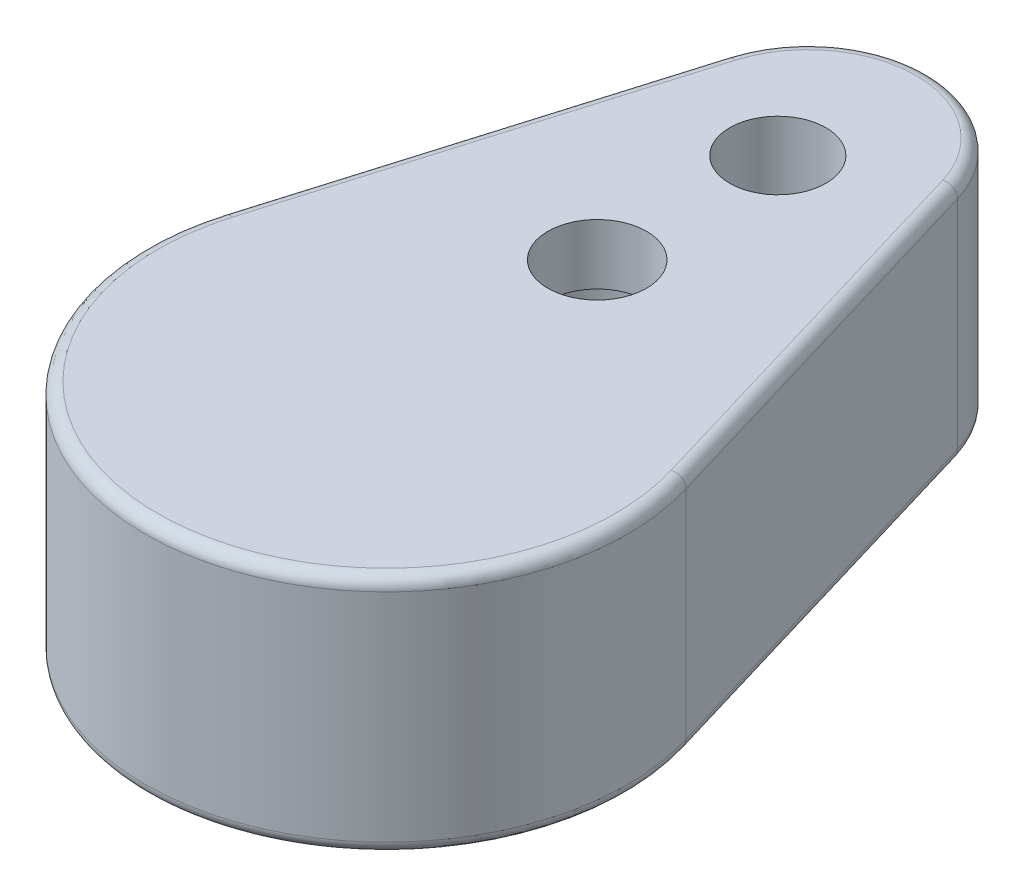
ISO-10303-21;
HEADER;
FILE_DESCRIPTION(('STEP AP214'),'2;1');
FILE_NAME('part.step','',(''),(''),'','','');
FILE_SCHEMA(('AUTOMOTIVE_DESIGN { 1 0 10303 214 1 1 1 1 }'));
ENDSEC;
DATA;
#1=APPLICATION_CONTEXT('core data for automotive mechanical design processes');
#2=APPLICATION_PROTOCOL_DEFINITION('international standard','automotive_design',2000,#1);
#3=PRODUCT_CONTEXT('',#1,'mechanical');
#4=PRODUCT('Part','Part','',(#3));
#5=PRODUCT_RELATED_PRODUCT_CATEGORY('part','',(#4));
#6=PRODUCT_DEFINITION_FORMATION('','',#4);
#7=PRODUCT_DEFINITION_CONTEXT('part definition',#1,'design');
#8=PRODUCT_DEFINITION('design','',#6,#7);
#9=PRODUCT_DEFINITION_SHAPE('','',#8);
#10=(LENGTH_UNIT() NAMED_UNIT(*) SI_UNIT(.MILLI.,.METRE.));
#11=(NAMED_UNIT(*) PLANE_ANGLE_UNIT() SI_UNIT($,.RADIAN.));
#12=(NAMED_UNIT(*) SI_UNIT($,.STERADIAN.) SOLID_ANGLE_UNIT());
#13=UNCERTAINTY_MEASURE_WITH_UNIT(LENGTH_MEASURE(1.E-05),#10,'distance_accuracy_value','');
#14=(GEOMETRIC_REPRESENTATION_CONTEXT(3) GLOBAL_UNCERTAINTY_ASSIGNED_CONTEXT((#13)) GLOBAL_UNIT_ASSIGNED_CONTEXT((#10,
#11,#12)) REPRESENTATION_CONTEXT('',''));
#15=CARTESIAN_POINT('',(0.,0.,0.));
#16=DIRECTION('',(0.,0.,1.));
#17=DIRECTION('',(1.,0.,0.));
#18=AXIS2_PLACEMENT_3D('',#15,#16,#17);
#19=CARTESIAN_POINT('',(0.,20.,17.5));
#20=DIRECTION('',(0.,-1.,0.));
#21=DIRECTION('',(0.,0.,-1.));
#22=AXIS2_PLACEMENT_3D('',#19,#20,#21);
#23=CYLINDRICAL_SURFACE('',#22,20.);
#24=DIRECTION('',(0.,-1.,0.));
#25=VECTOR('',#24,1.);
#26=CARTESIAN_POINT('',(-19.1662969499982,20.,11.7857142857143));
#27=LINE('',#26,#25);
#28=CARTESIAN_POINT('',(-19.1662969499982,19.,11.7857142857143));
#29=VERTEX_POINT('',#28);
#30=CARTESIAN_POINT('',(-19.1662969499982,1.,11.7857142857143));
#31=VERTEX_POINT('',#30);
#32=EDGE_CURVE('E111',#29,#31,#27,.T.);
#33=ORIENTED_EDGE('',*,*,#32,.T.);
#34=CARTESIAN_POINT('',(0.,1.,17.5));
#35=DIRECTION('',(0.,1.,0.));
#36=DIRECTION('',(0.,0.,1.));
#37=AXIS2_PLACEMENT_3D('',#34,#35,#36);
#38=CIRCLE('',#37,20.);
#39=CARTESIAN_POINT('',(19.1662969499982,1.,11.7857142857143));
#40=VERTEX_POINT('',#39);
#41=EDGE_CURVE('E224',#31,#40,#38,.T.);
#42=ORIENTED_EDGE('',*,*,#41,.T.);
#43=DIRECTION('',(0.,-1.,0.));
#44=VECTOR('',#43,1.);
#45=CARTESIAN_POINT('',(19.1662969499982,20.,11.7857142857143));
#46=LINE('',#45,#44);
#47=CARTESIAN_POINT('',(19.1662969499982,19.,11.7857142857143));
#48=VERTEX_POINT('',#47);
#49=EDGE_CURVE('E140',#48,#40,#46,.T.);
#50=ORIENTED_EDGE('',*,*,#49,.F.);
#51=CARTESIAN_POINT('',(0.,19.,17.5));
#52=DIRECTION('',(0.,1.,0.));
#53=DIRECTION('',(0.,0.,1.));
#54=AXIS2_PLACEMENT_3D('',#51,#52,#53);
#55=CIRCLE('',#54,20.);
#56=EDGE_CURVE('E221',#48,#29,#55,.F.);
#57=ORIENTED_EDGE('',*,*,#56,.T.);
#58=EDGE_LOOP('',(#33,#42,#50,#57));
#59=FACE_BOUND('',#58,.T.);
#60=ADVANCED_FACE('F39',(#59),#23,.T.);
#61=CARTESIAN_POINT('',(9.58314847499909,20.,-20.3571428571429));
#62=DIRECTION('',(-0.95831484749991,0.,0.285714285714286));
#63=DIRECTION('',(0.285714285714286,0.,0.95831484749991));
#64=AXIS2_PLACEMENT_3D('',#61,#62,#63);
#65=PLANE('',#64);
#66=ORIENTED_EDGE('',*,*,#49,.T.);
#67=DIRECTION('',(-0.285714285714286,0.,-0.95831484749991));
#68=VECTOR('',#67,1.);
#69=CARTESIAN_POINT('',(9.58314847499909,1.,-20.3571428571429));
#70=LINE('',#69,#68);
#71=CARTESIAN_POINT('',(9.5831484749991,1.,-20.3571428571429));
#72=VERTEX_POINT('',#71);
#73=EDGE_CURVE('E218',#40,#72,#70,.T.);
#74=ORIENTED_EDGE('',*,*,#73,.T.);
#75=DIRECTION('',(0.,-1.,0.));
#76=VECTOR('',#75,1.);
#77=CARTESIAN_POINT('',(9.5831484749991,20.,-20.3571428571429));
#78=LINE('',#77,#76);
#79=CARTESIAN_POINT('',(9.5831484749991,19.,-20.3571428571429));
#80=VERTEX_POINT('',#79);
#81=EDGE_CURVE('E130',#80,#72,#78,.T.);
#82=ORIENTED_EDGE('',*,*,#81,.F.);
#83=DIRECTION('',(-0.285714285714286,0.,-0.95831484749991));
#84=VECTOR('',#83,1.);
#85=CARTESIAN_POINT('',(19.1662969499982,19.,11.7857142857143));
#86=LINE('',#85,#84);
#87=EDGE_CURVE('E215',#80,#48,#86,.F.);
#88=ORIENTED_EDGE('',*,*,#87,.T.);
#89=EDGE_LOOP('',(#66,#74,#82,#88));
#90=FACE_BOUND('',#89,.T.);
#91=ADVANCED_FACE('F284',(#90),#65,.F.);
#92=CARTESIAN_POINT('',(0.,20.,-17.5));
#93=DIRECTION('',(0.,-1.,0.));
#94=DIRECTION('',(0.,0.,-1.));
#95=AXIS2_PLACEMENT_3D('',#92,#93,#94);
#96=CYLINDRICAL_SURFACE('',#95,10.);
#97=ORIENTED_EDGE('',*,*,#81,.T.);
#98=CARTESIAN_POINT('',(0.,1.,-17.5));
#99=DIRECTION('',(0.,1.,0.));
#100=DIRECTION('',(0.,0.,1.));
#101=AXIS2_PLACEMENT_3D('',#98,#99,#100);
#102=CIRCLE('',#101,10.);
#103=CARTESIAN_POINT('',(-9.5831484749991,1.,-20.3571428571429));
#104=VERTEX_POINT('',#103);
#105=EDGE_CURVE('E128',#72,#104,#102,.T.);
#106=ORIENTED_EDGE('',*,*,#105,.T.);
#107=DIRECTION('',(0.,-1.,0.));
#108=VECTOR('',#107,1.);
#109=CARTESIAN_POINT('',(-9.5831484749991,20.,-20.3571428571429));
#110=LINE('',#109,#108);
#111=CARTESIAN_POINT('',(-9.5831484749991,19.,-20.3571428571429));
#112=VERTEX_POINT('',#111);
#113=EDGE_CURVE('E109',#112,#104,#110,.T.);
#114=ORIENTED_EDGE('',*,*,#113,.F.);
#115=CARTESIAN_POINT('',(0.,19.,-17.5));
#116=DIRECTION('',(0.,1.,0.));
#117=DIRECTION('',(0.,0.,1.));
#118=AXIS2_PLACEMENT_3D('',#115,#116,#117);
#119=CIRCLE('',#118,10.);
#120=EDGE_CURVE('E125',#112,#80,#119,.F.);
#121=ORIENTED_EDGE('',*,*,#120,.T.);
#122=EDGE_LOOP('',(#97,#106,#114,#121));
#123=FACE_BOUND('',#122,.T.);
#124=ADVANCED_FACE('F124',(#123),#96,.T.);
#125=CARTESIAN_POINT('',(-9.5831484749991,20.,-20.3571428571429));
#126=DIRECTION('',(0.95831484749991,0.,0.285714285714286));
#127=DIRECTION('',(0.285714285714286,0.,-0.95831484749991));
#128=AXIS2_PLACEMENT_3D('',#125,#126,#127);
#129=PLANE('',#128);
#130=ORIENTED_EDGE('',*,*,#113,.T.);
#131=DIRECTION('',(-0.285714285714286,0.,0.95831484749991));
#132=VECTOR('',#131,1.);
#133=CARTESIAN_POINT('',(-9.5831484749991,1.,-20.3571428571429));
#134=LINE('',#133,#132);
#135=EDGE_CURVE('E11',#104,#31,#134,.T.);
#136=ORIENTED_EDGE('',*,*,#135,.T.);
#137=ORIENTED_EDGE('',*,*,#32,.F.);
#138=DIRECTION('',(-0.285714285714286,0.,0.95831484749991));
#139=VECTOR('',#138,1.);
#140=CARTESIAN_POINT('',(-9.5831484749991,19.,-20.3571428571429));
#141=LINE('',#140,#139);
#142=EDGE_CURVE('E49',#29,#112,#141,.F.);
#143=ORIENTED_EDGE('',*,*,#142,.T.);
#144=EDGE_LOOP('',(#130,#136,#137,#143));
#145=FACE_BOUND('',#144,.T.);
#146=ADVANCED_FACE('F108',(#145),#129,.F.);
#147=CARTESIAN_POINT('',(0.,20.,17.5));
#148=DIRECTION('',(0.,1.,0.));
#149=DIRECTION('',(0.,0.,1.));
#150=AXIS2_PLACEMENT_3D('',#147,#148,#149);
#151=PLANE('',#150);
#152=CARTESIAN_POINT('',(0.,20.,0.));
#153=DIRECTION('',(0.,-1.,0.));
#154=DIRECTION('',(0.,0.,-1.));
#155=AXIS2_PLACEMENT_3D('',#152,#153,#154);
#156=CIRCLE('',#155,4.1);
#157=CARTESIAN_POINT('',(0.,20.,-4.1));
#158=VERTEX_POINT('',#157);
#159=EDGE_CURVE('E167',#158,#158,#156,.T.);
#160=ORIENTED_EDGE('',*,*,#159,.T.);
#161=EDGE_LOOP('',(#160));
#162=FACE_BOUND('',#161,.T.);
#163=CARTESIAN_POINT('',(0.,20.,-15.));
#164=DIRECTION('',(0.,1.,0.));
#165=DIRECTION('',(0.,0.,1.));
#166=AXIS2_PLACEMENT_3D('',#163,#164,#165);
#167=CIRCLE('',#166,4.);
#168=CARTESIAN_POINT('',(0.,20.,-11.));
#169=VERTEX_POINT('',#168);
#170=EDGE_CURVE('E152',#169,#169,#167,.T.);
#171=ORIENTED_EDGE('',*,*,#170,.F.);
#172=EDGE_LOOP('',(#171));
#173=FACE_BOUND('',#172,.T.);
#174=DIRECTION('',(-0.285714285714286,0.,-0.95831484749991));
#175=VECTOR('',#174,1.);
#176=CARTESIAN_POINT('',(8.62483362749918,20.,-20.0714285714286));
#177=LINE('',#176,#175);
#178=CARTESIAN_POINT('',(18.2079821024983,20.,12.0714285714286));
#179=VERTEX_POINT('',#178);
#180=CARTESIAN_POINT('',(8.62483362749918,20.,-20.0714285714286));
#181=VERTEX_POINT('',#180);
#182=EDGE_CURVE('E57',#179,#181,#177,.T.);
#183=ORIENTED_EDGE('',*,*,#182,.T.);
#184=CARTESIAN_POINT('',(0.,20.,-17.5));
#185=DIRECTION('',(0.,1.,0.));
#186=DIRECTION('',(0.,0.,1.));
#187=AXIS2_PLACEMENT_3D('',#184,#185,#186);
#188=CIRCLE('',#187,9.);
#189=CARTESIAN_POINT('',(-8.62483362749919,20.,-20.0714285714286));
#190=VERTEX_POINT('',#189);
#191=EDGE_CURVE('E117',#181,#190,#188,.T.);
#192=ORIENTED_EDGE('',*,*,#191,.T.);
#193=DIRECTION('',(-0.285714285714286,0.,0.95831484749991));
#194=VECTOR('',#193,1.);
#195=CARTESIAN_POINT('',(-18.2079821024983,20.,12.0714285714286));
#196=LINE('',#195,#194);
#197=CARTESIAN_POINT('',(-18.2079821024983,20.,12.0714285714286));
#198=VERTEX_POINT('',#197);
#199=EDGE_CURVE('E143',#190,#198,#196,.T.);
#200=ORIENTED_EDGE('',*,*,#199,.T.);
#201=CARTESIAN_POINT('',(0.,20.,17.5));
#202=DIRECTION('',(0.,1.,0.));
#203=DIRECTION('',(0.,0.,1.));
#204=AXIS2_PLACEMENT_3D('',#201,#202,#203);
#205=CIRCLE('',#204,19.);
#206=EDGE_CURVE('E62',#198,#179,#205,.T.);
#207=ORIENTED_EDGE('',*,*,#206,.T.);
#208=EDGE_LOOP('',(#183,#192,#200,#207));
#209=FACE_BOUND('',#208,.T.);
#210=ADVANCED_FACE('F271',(#162,#173,#209),#151,.T.);
#211=CARTESIAN_POINT('',(0.,0.,17.5));
#212=DIRECTION('',(0.,1.,0.));
#213=DIRECTION('',(0.,0.,1.));
#214=AXIS2_PLACEMENT_3D('',#211,#212,#213);
#215=PLANE('',#214);
#216=CARTESIAN_POINT('',(0.,0.,-15.));
#217=DIRECTION('',(0.,-1.,0.));
#218=DIRECTION('',(0.,0.,-1.));
#219=AXIS2_PLACEMENT_3D('',#216,#217,#218);
#220=CIRCLE('',#219,3.1);
#221=CARTESIAN_POINT('',(0.,0.,-18.1));
#222=VERTEX_POINT('',#221);
#223=EDGE_CURVE('E175',#222,#222,#220,.T.);
#224=ORIENTED_EDGE('',*,*,#223,.F.);
#225=EDGE_LOOP('',(#224));
#226=FACE_BOUND('',#225,.T.);
#227=CARTESIAN_POINT('',(0.,0.,0.));
#228=DIRECTION('',(0.,-1.,0.));
#229=DIRECTION('',(0.,0.,-1.));
#230=AXIS2_PLACEMENT_3D('',#227,#228,#229);
#231=CIRCLE('',#230,5.);
#232=CARTESIAN_POINT('',(0.,0.,-5.));
#233=VERTEX_POINT('',#232);
#234=EDGE_CURVE('E173',#233,#233,#231,.T.);
#235=ORIENTED_EDGE('',*,*,#234,.F.);
#236=EDGE_LOOP('',(#235));
#237=FACE_BOUND('',#236,.T.);
#238=DIRECTION('',(-0.285714285714286,0.,0.95831484749991));
#239=VECTOR('',#238,1.);
#240=CARTESIAN_POINT('',(-18.2079821024983,0.,12.0714285714286));
#241=LINE('',#240,#239);
#242=CARTESIAN_POINT('',(-18.2079821024983,0.,12.0714285714286));
#243=VERTEX_POINT('',#242);
#244=CARTESIAN_POINT('',(-8.62483362749919,0.,-20.0714285714286));
#245=VERTEX_POINT('',#244);
#246=EDGE_CURVE('E202',#243,#245,#241,.F.);
#247=ORIENTED_EDGE('',*,*,#246,.T.);
#248=CARTESIAN_POINT('',(0.,0.,-17.5));
#249=DIRECTION('',(0.,1.,0.));
#250=DIRECTION('',(0.,0.,1.));
#251=AXIS2_PLACEMENT_3D('',#248,#249,#250);
#252=CIRCLE('',#251,9.);
#253=CARTESIAN_POINT('',(8.62483362749918,0.,-20.0714285714286));
#254=VERTEX_POINT('',#253);
#255=EDGE_CURVE('E211',#245,#254,#252,.F.);
#256=ORIENTED_EDGE('',*,*,#255,.T.);
#257=DIRECTION('',(-0.285714285714286,0.,-0.95831484749991));
#258=VECTOR('',#257,1.);
#259=CARTESIAN_POINT('',(18.2079821024983,0.,12.0714285714286));
#260=LINE('',#259,#258);
#261=CARTESIAN_POINT('',(18.2079821024983,0.,12.0714285714286));
#262=VERTEX_POINT('',#261);
#263=EDGE_CURVE('E208',#254,#262,#260,.F.);
#264=ORIENTED_EDGE('',*,*,#263,.T.);
#265=CARTESIAN_POINT('',(0.,0.,17.5));
#266=DIRECTION('',(0.,1.,0.));
#267=DIRECTION('',(0.,0.,1.));
#268=AXIS2_PLACEMENT_3D('',#265,#266,#267);
#269=CIRCLE('',#268,19.);
#270=EDGE_CURVE('E205',#262,#243,#269,.F.);
#271=ORIENTED_EDGE('',*,*,#270,.T.);
#272=EDGE_LOOP('',(#247,#256,#264,#271));
#273=FACE_BOUND('',#272,.T.);
#274=ADVANCED_FACE('F259',(#226,#237,#273),#215,.F.);
#275=CARTESIAN_POINT('',(0.,1.,17.5));
#276=DIRECTION('',(0.,1.,0.));
#277=DIRECTION('',(0.,0.,1.));
#278=AXIS2_PLACEMENT_3D('',#275,#276,#277);
#279=TOROIDAL_SURFACE('',#278,19.,1.);
#280=CARTESIAN_POINT('',(-18.2079821024983,1.,12.0714285714286));
#281=DIRECTION('',(0.285714285714285,0.,-0.95831484749991));
#282=DIRECTION('',(-0.95831484749991,0.,-0.285714285714285));
#283=AXIS2_PLACEMENT_3D('',#280,#281,#282);
#284=CIRCLE('',#283,1.);
#285=EDGE_CURVE('E239',#243,#31,#284,.T.);
#286=ORIENTED_EDGE('',*,*,#285,.F.);
#287=ORIENTED_EDGE('',*,*,#270,.F.);
#288=CARTESIAN_POINT('',(18.2079821024983,1.,12.0714285714286));
#289=DIRECTION('',(-0.285714285714285,0.,-0.95831484749991));
#290=DIRECTION('',(-0.95831484749991,0.,0.285714285714285));
#291=AXIS2_PLACEMENT_3D('',#288,#289,#290);
#292=CIRCLE('',#291,1.);
#293=EDGE_CURVE('E155',#40,#262,#292,.T.);
#294=ORIENTED_EDGE('',*,*,#293,.F.);
#295=ORIENTED_EDGE('',*,*,#41,.F.);
#296=EDGE_LOOP('',(#286,#287,#294,#295));
#297=FACE_BOUND('',#296,.T.);
#298=ADVANCED_FACE('F257',(#297),#279,.T.);
#299=CARTESIAN_POINT('',(8.62483362749918,1.,-20.0714285714286));
#300=DIRECTION('',(-0.285714285714286,0.,-0.95831484749991));
#301=DIRECTION('',(-0.95831484749991,0.,0.285714285714286));
#302=AXIS2_PLACEMENT_3D('',#299,#300,#301);
#303=CYLINDRICAL_SURFACE('',#302,1.);
#304=ORIENTED_EDGE('',*,*,#293,.T.);
#305=ORIENTED_EDGE('',*,*,#263,.F.);
#306=CARTESIAN_POINT('',(8.62483362749918,1.,-20.0714285714286));
#307=DIRECTION('',(-0.285714285714285,0.,-0.95831484749991));
#308=DIRECTION('',(-0.95831484749991,0.,0.285714285714285));
#309=AXIS2_PLACEMENT_3D('',#306,#307,#308);
#310=CIRCLE('',#309,1.);
#311=EDGE_CURVE('E237',#72,#254,#310,.T.);
#312=ORIENTED_EDGE('',*,*,#311,.F.);
#313=ORIENTED_EDGE('',*,*,#73,.F.);
#314=EDGE_LOOP('',(#304,#305,#312,#313));
#315=FACE_BOUND('',#314,.T.);
#316=ADVANCED_FACE('F252',(#315),#303,.T.);
#317=CARTESIAN_POINT('',(-8.62483362749919,1.,-20.0714285714286));
#318=DIRECTION('',(-0.285714285714286,0.,0.95831484749991));
#319=DIRECTION('',(0.95831484749991,0.,0.285714285714286));
#320=AXIS2_PLACEMENT_3D('',#317,#318,#319);
#321=CYLINDRICAL_SURFACE('',#320,1.);
#322=ORIENTED_EDGE('',*,*,#285,.T.);
#323=ORIENTED_EDGE('',*,*,#135,.F.);
#324=CARTESIAN_POINT('',(-8.62483362749919,1.,-20.0714285714286));
#325=DIRECTION('',(0.285714285714285,0.,-0.95831484749991));
#326=DIRECTION('',(-0.95831484749991,0.,-0.285714285714285));
#327=AXIS2_PLACEMENT_3D('',#324,#325,#326);
#328=CIRCLE('',#327,1.);
#329=EDGE_CURVE('E163',#245,#104,#328,.T.);
#330=ORIENTED_EDGE('',*,*,#329,.F.);
#331=ORIENTED_EDGE('',*,*,#246,.F.);
#332=EDGE_LOOP('',(#322,#323,#330,#331));
#333=FACE_BOUND('',#332,.T.);
#334=ADVANCED_FACE('F264',(#333),#321,.T.);
#335=CARTESIAN_POINT('',(0.,1.,-17.5));
#336=DIRECTION('',(0.,1.,0.));
#337=DIRECTION('',(0.,0.,1.));
#338=AXIS2_PLACEMENT_3D('',#335,#336,#337);
#339=TOROIDAL_SURFACE('',#338,9.,1.);
#340=ORIENTED_EDGE('',*,*,#311,.T.);
#341=ORIENTED_EDGE('',*,*,#255,.F.);
#342=ORIENTED_EDGE('',*,*,#329,.T.);
#343=ORIENTED_EDGE('',*,*,#105,.F.);
#344=EDGE_LOOP('',(#340,#341,#342,#343));
#345=FACE_BOUND('',#344,.T.);
#346=ADVANCED_FACE('F263',(#345),#339,.T.);
#347=CARTESIAN_POINT('',(0.,19.,17.5));
#348=DIRECTION('',(0.,1.,0.));
#349=DIRECTION('',(0.,0.,1.));
#350=AXIS2_PLACEMENT_3D('',#347,#348,#349);
#351=TOROIDAL_SURFACE('',#350,19.,1.);
#352=CARTESIAN_POINT('',(-18.2079821024983,19.,12.0714285714286));
#353=DIRECTION('',(0.285714285714285,0.,-0.95831484749991));
#354=DIRECTION('',(-0.95831484749991,0.,-0.285714285714285));
#355=AXIS2_PLACEMENT_3D('',#352,#353,#354);
#356=CIRCLE('',#355,1.);
#357=EDGE_CURVE('E149',#29,#198,#356,.T.);
#358=ORIENTED_EDGE('',*,*,#357,.F.);
#359=ORIENTED_EDGE('',*,*,#56,.F.);
#360=CARTESIAN_POINT('',(18.2079821024983,19.,12.0714285714286));
#361=DIRECTION('',(-0.285714285714287,0.,-0.95831484749991));
#362=DIRECTION('',(-0.95831484749991,0.,0.285714285714287));
#363=AXIS2_PLACEMENT_3D('',#360,#361,#362);
#364=CIRCLE('',#363,1.);
#365=EDGE_CURVE('E160',#179,#48,#364,.T.);
#366=ORIENTED_EDGE('',*,*,#365,.F.);
#367=ORIENTED_EDGE('',*,*,#206,.F.);
#368=EDGE_LOOP('',(#358,#359,#366,#367));
#369=FACE_BOUND('',#368,.T.);
#370=ADVANCED_FACE('F41',(#369),#351,.T.);
#371=CARTESIAN_POINT('',(18.2079821024983,19.,12.0714285714286));
#372=DIRECTION('',(0.285714285714286,0.,0.95831484749991));
#373=DIRECTION('',(0.95831484749991,0.,-0.285714285714286));
#374=AXIS2_PLACEMENT_3D('',#371,#372,#373);
#375=CYLINDRICAL_SURFACE('',#374,1.);
#376=ORIENTED_EDGE('',*,*,#365,.T.);
#377=ORIENTED_EDGE('',*,*,#87,.F.);
#378=CARTESIAN_POINT('',(8.62483362749918,19.,-20.0714285714286));
#379=DIRECTION('',(-0.285714285714284,0.,-0.95831484749991));
#380=DIRECTION('',(-0.95831484749991,0.,0.285714285714284));
#381=AXIS2_PLACEMENT_3D('',#378,#379,#380);
#382=CIRCLE('',#381,1.);
#383=EDGE_CURVE('E137',#181,#80,#382,.T.);
#384=ORIENTED_EDGE('',*,*,#383,.F.);
#385=ORIENTED_EDGE('',*,*,#182,.F.);
#386=EDGE_LOOP('',(#376,#377,#384,#385));
#387=FACE_BOUND('',#386,.T.);
#388=ADVANCED_FACE('F270',(#387),#375,.T.);
#389=CARTESIAN_POINT('',(-18.2079821024983,19.,12.0714285714286));
#390=DIRECTION('',(0.285714285714286,0.,-0.95831484749991));
#391=DIRECTION('',(-0.95831484749991,0.,-0.285714285714286));
#392=AXIS2_PLACEMENT_3D('',#389,#390,#391);
#393=CYLINDRICAL_SURFACE('',#392,1.);
#394=ORIENTED_EDGE('',*,*,#357,.T.);
#395=ORIENTED_EDGE('',*,*,#199,.F.);
#396=CARTESIAN_POINT('',(-8.62483362749919,19.,-20.0714285714286));
#397=DIRECTION('',(0.285714285714285,0.,-0.95831484749991));
#398=DIRECTION('',(-0.95831484749991,0.,-0.285714285714285));
#399=AXIS2_PLACEMENT_3D('',#396,#397,#398);
#400=CIRCLE('',#399,1.);
#401=EDGE_CURVE('E135',#112,#190,#400,.T.);
#402=ORIENTED_EDGE('',*,*,#401,.F.);
#403=ORIENTED_EDGE('',*,*,#142,.F.);
#404=EDGE_LOOP('',(#394,#395,#402,#403));
#405=FACE_BOUND('',#404,.T.);
#406=ADVANCED_FACE('F142',(#405),#393,.T.);
#407=CARTESIAN_POINT('',(0.,19.,-17.5));
#408=DIRECTION('',(0.,1.,0.));
#409=DIRECTION('',(0.,0.,1.));
#410=AXIS2_PLACEMENT_3D('',#407,#408,#409);
#411=TOROIDAL_SURFACE('',#410,9.,1.);
#412=ORIENTED_EDGE('',*,*,#383,.T.);
#413=ORIENTED_EDGE('',*,*,#120,.F.);
#414=ORIENTED_EDGE('',*,*,#401,.T.);
#415=ORIENTED_EDGE('',*,*,#191,.F.);
#416=EDGE_LOOP('',(#412,#413,#414,#415));
#417=FACE_BOUND('',#416,.T.);
#418=ADVANCED_FACE('F133',(#417),#411,.T.);
#419=CARTESIAN_POINT('',(0.,5.,-15.));
#420=DIRECTION('',(0.,1.,0.));
#421=DIRECTION('',(0.,0.,1.));
#422=AXIS2_PLACEMENT_3D('',#419,#420,#421);
#423=CYLINDRICAL_SURFACE('',#422,4.);
#424=CARTESIAN_POINT('',(0.,5.,-15.));
#425=DIRECTION('',(0.,1.,0.));
#426=DIRECTION('',(0.,0.,1.));
#427=AXIS2_PLACEMENT_3D('',#424,#425,#426);
#428=CIRCLE('',#427,4.);
#429=CARTESIAN_POINT('',(0.,5.,-11.));
#430=VERTEX_POINT('',#429);
#431=EDGE_CURVE('E145',#430,#430,#428,.T.);
#432=ORIENTED_EDGE('',*,*,#431,.F.);
#433=EDGE_LOOP('',(#432));
#434=FACE_BOUND('',#433,.T.);
#435=ORIENTED_EDGE('',*,*,#170,.T.);
#436=EDGE_LOOP('',(#435));
#437=FACE_BOUND('',#436,.T.);
#438=ADVANCED_FACE('F303',(#434,#437),#423,.F.);
#439=CARTESIAN_POINT('',(0.,5.,-15.));
#440=DIRECTION('',(0.,1.,0.));
#441=DIRECTION('',(0.,0.,1.));
#442=AXIS2_PLACEMENT_3D('',#439,#440,#441);
#443=PLANE('',#442);
#444=CARTESIAN_POINT('',(0.,5.,-15.));
#445=DIRECTION('',(0.,1.,0.));
#446=DIRECTION('',(0.,0.,1.));
#447=AXIS2_PLACEMENT_3D('',#444,#445,#446);
#448=CIRCLE('',#447,3.1);
#449=CARTESIAN_POINT('',(0.,5.,-11.9));
#450=VERTEX_POINT('',#449);
#451=EDGE_CURVE('E43',#450,#450,#448,.T.);
#452=ORIENTED_EDGE('',*,*,#451,.F.);
#453=EDGE_LOOP('',(#452));
#454=FACE_BOUND('',#453,.T.);
#455=ORIENTED_EDGE('',*,*,#431,.T.);
#456=EDGE_LOOP('',(#455));
#457=FACE_BOUND('',#456,.T.);
#458=ADVANCED_FACE('F340',(#454,#457),#443,.T.);
#459=CARTESIAN_POINT('',(0.,15.,0.));
#460=DIRECTION('',(0.,-1.,0.));
#461=DIRECTION('',(0.,0.,-1.));
#462=AXIS2_PLACEMENT_3D('',#459,#460,#461);
#463=CYLINDRICAL_SURFACE('',#462,5.);
#464=CARTESIAN_POINT('',(0.,15.,0.));
#465=DIRECTION('',(0.,-1.,0.));
#466=DIRECTION('',(0.,0.,-1.));
#467=AXIS2_PLACEMENT_3D('',#464,#465,#466);
#468=CIRCLE('',#467,5.);
#469=CARTESIAN_POINT('',(0.,15.,-5.));
#470=VERTEX_POINT('',#469);
#471=EDGE_CURVE('E183',#470,#470,#468,.T.);
#472=ORIENTED_EDGE('',*,*,#471,.F.);
#473=EDGE_LOOP('',(#472));
#474=FACE_BOUND('',#473,.T.);
#475=ORIENTED_EDGE('',*,*,#234,.T.);
#476=EDGE_LOOP('',(#475));
#477=FACE_BOUND('',#476,.T.);
#478=ADVANCED_FACE('F345',(#474,#477),#463,.F.);
#479=CARTESIAN_POINT('',(0.,15.,0.));
#480=DIRECTION('',(0.,-1.,0.));
#481=DIRECTION('',(0.,0.,-1.));
#482=AXIS2_PLACEMENT_3D('',#479,#480,#481);
#483=PLANE('',#482);
#484=CARTESIAN_POINT('',(0.,15.,0.));
#485=DIRECTION('',(0.,-1.,0.));
#486=DIRECTION('',(0.,0.,-1.));
#487=AXIS2_PLACEMENT_3D('',#484,#485,#486);
#488=CIRCLE('',#487,4.1);
#489=CARTESIAN_POINT('',(0.,15.,-4.1));
#490=VERTEX_POINT('',#489);
#491=EDGE_CURVE('E164',#490,#490,#488,.T.);
#492=ORIENTED_EDGE('',*,*,#491,.F.);
#493=EDGE_LOOP('',(#492));
#494=FACE_BOUND('',#493,.T.);
#495=ORIENTED_EDGE('',*,*,#471,.T.);
#496=EDGE_LOOP('',(#495));
#497=FACE_BOUND('',#496,.T.);
#498=ADVANCED_FACE('F355',(#494,#497),#483,.T.);
#499=CARTESIAN_POINT('',(0.,20.,0.));
#500=DIRECTION('',(0.,-1.,0.));
#501=DIRECTION('',(0.,0.,-1.));
#502=AXIS2_PLACEMENT_3D('',#499,#500,#501);
#503=CYLINDRICAL_SURFACE('',#502,4.1);
#504=ORIENTED_EDGE('',*,*,#491,.T.);
#505=EDGE_LOOP('',(#504));
#506=FACE_BOUND('',#505,.T.);
#507=ORIENTED_EDGE('',*,*,#159,.F.);
#508=EDGE_LOOP('',(#507));
#509=FACE_BOUND('',#508,.T.);
#510=ADVANCED_FACE('F360',(#506,#509),#503,.F.);
#511=CARTESIAN_POINT('',(0.,20.,-15.));
#512=DIRECTION('',(0.,-1.,0.));
#513=DIRECTION('',(0.,0.,-1.));
#514=AXIS2_PLACEMENT_3D('',#511,#512,#513);
#515=CYLINDRICAL_SURFACE('',#514,3.1);
#516=ORIENTED_EDGE('',*,*,#451,.T.);
#517=EDGE_LOOP('',(#516));
#518=FACE_BOUND('',#517,.T.);
#519=ORIENTED_EDGE('',*,*,#223,.T.);
#520=EDGE_LOOP('',(#519));
#521=FACE_BOUND('',#520,.T.);
#522=ADVANCED_FACE('F370',(#518,#521),#515,.F.);
#523=CLOSED_SHELL('',(#60,#91,#124,#146,#210,#274,#298,#316,#334,#346,#370,#388,#406,#418,#438,
#458,#478,#498,#510,#522));
#524=MANIFOLD_SOLID_BREP('B2',#523);
#525=ADVANCED_BREP_SHAPE_REPRESENTATION('',(#18,#524),#14);
#526=SHAPE_DEFINITION_REPRESENTATION(#9,#525);
ENDSEC;
END-ISO-10303-21;
